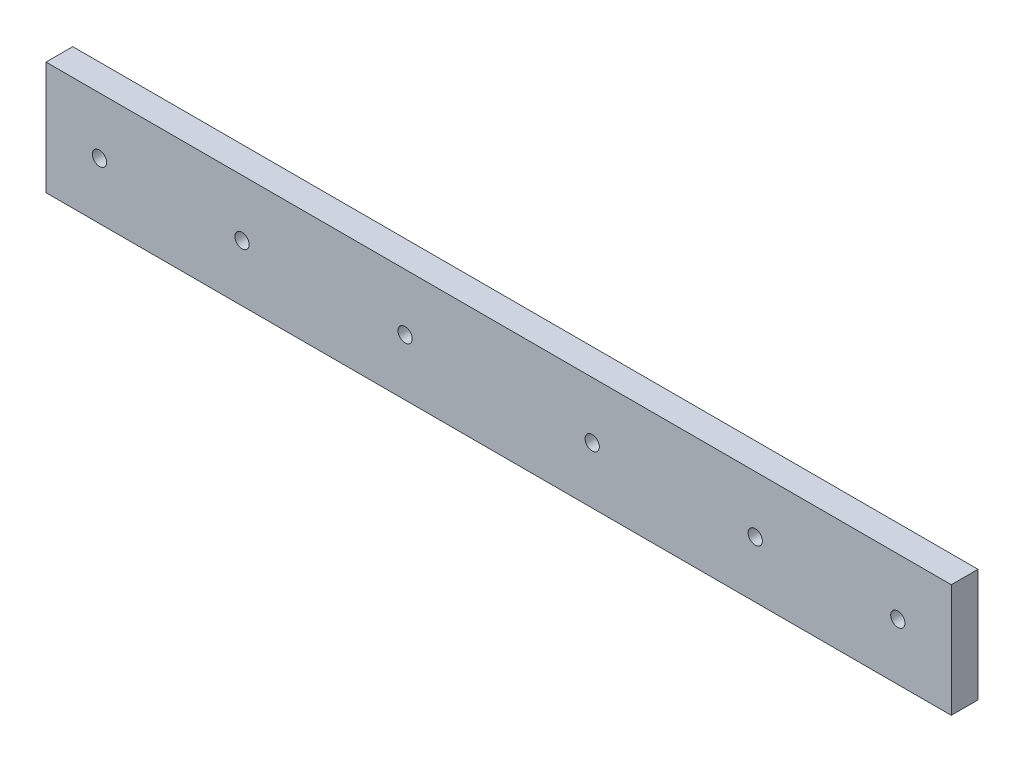
ISO-10303-21;
HEADER;
FILE_DESCRIPTION(('STEP AP214'),'2;1');
FILE_NAME('part.step','',(''),(''),'','','');
FILE_SCHEMA(('AUTOMOTIVE_DESIGN { 1 0 10303 214 1 1 1 1 }'));
ENDSEC;
DATA;
#1=APPLICATION_CONTEXT('core data for automotive mechanical design processes');
#2=APPLICATION_PROTOCOL_DEFINITION('international standard','automotive_design',2000,#1);
#3=PRODUCT_CONTEXT('',#1,'mechanical');
#4=PRODUCT('Part','Part','',(#3));
#5=PRODUCT_RELATED_PRODUCT_CATEGORY('part','',(#4));
#6=PRODUCT_DEFINITION_FORMATION('','',#4);
#7=PRODUCT_DEFINITION_CONTEXT('part definition',#1,'design');
#8=PRODUCT_DEFINITION('design','',#6,#7);
#9=PRODUCT_DEFINITION_SHAPE('','',#8);
#10=(LENGTH_UNIT() NAMED_UNIT(*) SI_UNIT(.MILLI.,.METRE.));
#11=(NAMED_UNIT(*) PLANE_ANGLE_UNIT() SI_UNIT($,.RADIAN.));
#12=(NAMED_UNIT(*) SI_UNIT($,.STERADIAN.) SOLID_ANGLE_UNIT());
#13=UNCERTAINTY_MEASURE_WITH_UNIT(LENGTH_MEASURE(1.E-05),#10,'distance_accuracy_value','');
#14=(GEOMETRIC_REPRESENTATION_CONTEXT(3) GLOBAL_UNCERTAINTY_ASSIGNED_CONTEXT((#13)) GLOBAL_UNIT_ASSIGNED_CONTEXT((#10,
#11,#12)) REPRESENTATION_CONTEXT('',''));
#15=CARTESIAN_POINT('',(0.,0.,0.));
#16=DIRECTION('',(0.,0.,1.));
#17=DIRECTION('',(1.,0.,0.));
#18=AXIS2_PLACEMENT_3D('',#15,#16,#17);
#19=CARTESIAN_POINT('',(101.6,-12.7,6.));
#20=DIRECTION('',(-1.,0.,0.));
#21=DIRECTION('',(0.,0.,1.));
#22=AXIS2_PLACEMENT_3D('',#19,#20,#21);
#23=PLANE('',#22);
#24=DIRECTION('',(0.,1.,0.));
#25=VECTOR('',#24,1.);
#26=CARTESIAN_POINT('',(101.6,-12.7,0.));
#27=LINE('',#26,#25);
#28=CARTESIAN_POINT('',(101.6,-12.7,0.));
#29=VERTEX_POINT('',#28);
#30=CARTESIAN_POINT('',(101.6,12.7,0.));
#31=VERTEX_POINT('',#30);
#32=EDGE_CURVE('E99',#29,#31,#27,.T.);
#33=ORIENTED_EDGE('',*,*,#32,.T.);
#34=DIRECTION('',(0.,0.,-1.));
#35=VECTOR('',#34,1.);
#36=CARTESIAN_POINT('',(101.6,12.7,6.));
#37=LINE('',#36,#35);
#38=CARTESIAN_POINT('',(101.6,12.7,6.));
#39=VERTEX_POINT('',#38);
#40=EDGE_CURVE('E11',#39,#31,#37,.T.);
#41=ORIENTED_EDGE('',*,*,#40,.F.);
#42=DIRECTION('',(0.,1.,0.));
#43=VECTOR('',#42,1.);
#44=CARTESIAN_POINT('',(101.6,-12.7,6.));
#45=LINE('',#44,#43);
#46=CARTESIAN_POINT('',(101.6,-12.7,6.));
#47=VERTEX_POINT('',#46);
#48=EDGE_CURVE('E87',#47,#39,#45,.T.);
#49=ORIENTED_EDGE('',*,*,#48,.F.);
#50=DIRECTION('',(0.,0.,-1.));
#51=VECTOR('',#50,1.);
#52=CARTESIAN_POINT('',(101.6,-12.7,6.));
#53=LINE('',#52,#51);
#54=EDGE_CURVE('E95',#47,#29,#53,.T.);
#55=ORIENTED_EDGE('',*,*,#54,.T.);
#56=EDGE_LOOP('',(#33,#41,#49,#55));
#57=FACE_BOUND('',#56,.T.);
#58=ADVANCED_FACE('F36',(#57),#23,.F.);
#59=CARTESIAN_POINT('',(-101.6,12.7,6.));
#60=DIRECTION('',(0.,-1.,0.));
#61=DIRECTION('',(0.,0.,-1.));
#62=AXIS2_PLACEMENT_3D('',#59,#60,#61);
#63=PLANE('',#62);
#64=DIRECTION('',(-1.,0.,0.));
#65=VECTOR('',#64,1.);
#66=CARTESIAN_POINT('',(-101.6,12.7,0.));
#67=LINE('',#66,#65);
#68=CARTESIAN_POINT('',(-101.6,12.7,0.));
#69=VERTEX_POINT('',#68);
#70=EDGE_CURVE('E91',#31,#69,#67,.T.);
#71=ORIENTED_EDGE('',*,*,#70,.T.);
#72=DIRECTION('',(0.,0.,-1.));
#73=VECTOR('',#72,1.);
#74=CARTESIAN_POINT('',(-101.6,12.7,6.));
#75=LINE('',#74,#73);
#76=CARTESIAN_POINT('',(-101.6,12.7,6.));
#77=VERTEX_POINT('',#76);
#78=EDGE_CURVE('E44',#77,#69,#75,.T.);
#79=ORIENTED_EDGE('',*,*,#78,.F.);
#80=DIRECTION('',(-1.,0.,0.));
#81=VECTOR('',#80,1.);
#82=CARTESIAN_POINT('',(-101.6,12.7,6.));
#83=LINE('',#82,#81);
#84=EDGE_CURVE('E82',#39,#77,#83,.T.);
#85=ORIENTED_EDGE('',*,*,#84,.F.);
#86=ORIENTED_EDGE('',*,*,#40,.T.);
#87=EDGE_LOOP('',(#71,#79,#85,#86));
#88=FACE_BOUND('',#87,.T.);
#89=ADVANCED_FACE('F90',(#88),#63,.F.);
#90=CARTESIAN_POINT('',(-101.6,-12.7,6.));
#91=DIRECTION('',(1.,0.,0.));
#92=DIRECTION('',(0.,0.,-1.));
#93=AXIS2_PLACEMENT_3D('',#90,#91,#92);
#94=PLANE('',#93);
#95=DIRECTION('',(0.,-1.,0.));
#96=VECTOR('',#95,1.);
#97=CARTESIAN_POINT('',(-101.6,-12.7,0.));
#98=LINE('',#97,#96);
#99=CARTESIAN_POINT('',(-101.6,-12.7,0.));
#100=VERTEX_POINT('',#99);
#101=EDGE_CURVE('E69',#69,#100,#98,.T.);
#102=ORIENTED_EDGE('',*,*,#101,.T.);
#103=DIRECTION('',(0.,0.,-1.));
#104=VECTOR('',#103,1.);
#105=CARTESIAN_POINT('',(-101.6,-12.7,6.));
#106=LINE('',#105,#104);
#107=CARTESIAN_POINT('',(-101.6,-12.7,6.));
#108=VERTEX_POINT('',#107);
#109=EDGE_CURVE('E92',#108,#100,#106,.T.);
#110=ORIENTED_EDGE('',*,*,#109,.F.);
#111=DIRECTION('',(0.,-1.,0.));
#112=VECTOR('',#111,1.);
#113=CARTESIAN_POINT('',(-101.6,-12.7,6.));
#114=LINE('',#113,#112);
#115=EDGE_CURVE('E85',#77,#108,#114,.T.);
#116=ORIENTED_EDGE('',*,*,#115,.F.);
#117=ORIENTED_EDGE('',*,*,#78,.T.);
#118=EDGE_LOOP('',(#102,#110,#116,#117));
#119=FACE_BOUND('',#118,.T.);
#120=ADVANCED_FACE('F93',(#119),#94,.F.);
#121=CARTESIAN_POINT('',(-101.6,-12.7,6.));
#122=DIRECTION('',(0.,1.,0.));
#123=DIRECTION('',(0.,0.,1.));
#124=AXIS2_PLACEMENT_3D('',#121,#122,#123);
#125=PLANE('',#124);
#126=DIRECTION('',(1.,0.,0.));
#127=VECTOR('',#126,1.);
#128=CARTESIAN_POINT('',(-101.6,-12.7,0.));
#129=LINE('',#128,#127);
#130=EDGE_CURVE('E75',#100,#29,#129,.T.);
#131=ORIENTED_EDGE('',*,*,#130,.T.);
#132=ORIENTED_EDGE('',*,*,#54,.F.);
#133=DIRECTION('',(1.,0.,0.));
#134=VECTOR('',#133,1.);
#135=CARTESIAN_POINT('',(-101.6,-12.7,6.));
#136=LINE('',#135,#134);
#137=EDGE_CURVE('E52',#108,#47,#136,.T.);
#138=ORIENTED_EDGE('',*,*,#137,.F.);
#139=ORIENTED_EDGE('',*,*,#109,.T.);
#140=EDGE_LOOP('',(#131,#132,#138,#139));
#141=FACE_BOUND('',#140,.T.);
#142=ADVANCED_FACE('F107',(#141),#125,.F.);
#143=CARTESIAN_POINT('',(0.,0.,6.));
#144=DIRECTION('',(0.,0.,-1.));
#145=DIRECTION('',(-1.,0.,0.));
#146=AXIS2_PLACEMENT_3D('',#143,#144,#145);
#147=PLANE('',#146);
#148=CARTESIAN_POINT('',(89.6,0.,6.));
#149=DIRECTION('',(0.,0.,1.));
#150=DIRECTION('',(1.,0.,0.));
#151=AXIS2_PLACEMENT_3D('',#148,#149,#150);
#152=CIRCLE('',#151,1.6);
#153=CARTESIAN_POINT('',(91.2,0.,6.));
#154=VERTEX_POINT('',#153);
#155=EDGE_CURVE('E145',#154,#154,#152,.T.);
#156=ORIENTED_EDGE('',*,*,#155,.F.);
#157=EDGE_LOOP('',(#156));
#158=FACE_BOUND('',#157,.T.);
#159=CARTESIAN_POINT('',(57.6,0.,6.));
#160=DIRECTION('',(0.,0.,1.));
#161=DIRECTION('',(1.,0.,0.));
#162=AXIS2_PLACEMENT_3D('',#159,#160,#161);
#163=CIRCLE('',#162,1.6);
#164=CARTESIAN_POINT('',(59.2,0.,6.));
#165=VERTEX_POINT('',#164);
#166=EDGE_CURVE('E139',#165,#165,#163,.T.);
#167=ORIENTED_EDGE('',*,*,#166,.F.);
#168=EDGE_LOOP('',(#167));
#169=FACE_BOUND('',#168,.T.);
#170=CARTESIAN_POINT('',(21.,0.,6.));
#171=DIRECTION('',(0.,0.,1.));
#172=DIRECTION('',(1.,0.,0.));
#173=AXIS2_PLACEMENT_3D('',#170,#171,#172);
#174=CIRCLE('',#173,1.6);
#175=CARTESIAN_POINT('',(22.6,0.,6.));
#176=VERTEX_POINT('',#175);
#177=EDGE_CURVE('E133',#176,#176,#174,.T.);
#178=ORIENTED_EDGE('',*,*,#177,.F.);
#179=EDGE_LOOP('',(#178));
#180=FACE_BOUND('',#179,.T.);
#181=CARTESIAN_POINT('',(-21.,0.,6.));
#182=DIRECTION('',(0.,0.,1.));
#183=DIRECTION('',(1.,0.,0.));
#184=AXIS2_PLACEMENT_3D('',#181,#182,#183);
#185=CIRCLE('',#184,1.6);
#186=CARTESIAN_POINT('',(-19.4,0.,6.));
#187=VERTEX_POINT('',#186);
#188=EDGE_CURVE('E127',#187,#187,#185,.T.);
#189=ORIENTED_EDGE('',*,*,#188,.F.);
#190=EDGE_LOOP('',(#189));
#191=FACE_BOUND('',#190,.T.);
#192=CARTESIAN_POINT('',(-57.6,0.,6.));
#193=DIRECTION('',(0.,0.,1.));
#194=DIRECTION('',(1.,0.,0.));
#195=AXIS2_PLACEMENT_3D('',#192,#193,#194);
#196=CIRCLE('',#195,1.6);
#197=CARTESIAN_POINT('',(-56.,0.,6.));
#198=VERTEX_POINT('',#197);
#199=EDGE_CURVE('E121',#198,#198,#196,.T.);
#200=ORIENTED_EDGE('',*,*,#199,.F.);
#201=EDGE_LOOP('',(#200));
#202=FACE_BOUND('',#201,.T.);
#203=CARTESIAN_POINT('',(-89.6,0.,6.));
#204=DIRECTION('',(0.,0.,1.));
#205=DIRECTION('',(1.,0.,0.));
#206=AXIS2_PLACEMENT_3D('',#203,#204,#205);
#207=CIRCLE('',#206,1.6);
#208=CARTESIAN_POINT('',(-88.,0.,6.));
#209=VERTEX_POINT('',#208);
#210=EDGE_CURVE('E115',#209,#209,#207,.T.);
#211=ORIENTED_EDGE('',*,*,#210,.F.);
#212=EDGE_LOOP('',(#211));
#213=FACE_BOUND('',#212,.T.);
#214=ORIENTED_EDGE('',*,*,#48,.T.);
#215=ORIENTED_EDGE('',*,*,#84,.T.);
#216=ORIENTED_EDGE('',*,*,#115,.T.);
#217=ORIENTED_EDGE('',*,*,#137,.T.);
#218=EDGE_LOOP('',(#214,#215,#216,#217));
#219=FACE_BOUND('',#218,.T.);
#220=ADVANCED_FACE('F83',(#158,#169,#180,#191,#202,#213,#219),#147,.F.);
#221=CARTESIAN_POINT('',(0.,0.,0.));
#222=DIRECTION('',(0.,0.,-1.));
#223=DIRECTION('',(-1.,0.,0.));
#224=AXIS2_PLACEMENT_3D('',#221,#222,#223);
#225=PLANE('',#224);
#226=CARTESIAN_POINT('',(89.6,0.,0.));
#227=DIRECTION('',(0.,0.,1.));
#228=DIRECTION('',(1.,0.,0.));
#229=AXIS2_PLACEMENT_3D('',#226,#227,#228);
#230=CIRCLE('',#229,1.6);
#231=CARTESIAN_POINT('',(91.2,0.,0.));
#232=VERTEX_POINT('',#231);
#233=EDGE_CURVE('E142',#232,#232,#230,.T.);
#234=ORIENTED_EDGE('',*,*,#233,.T.);
#235=EDGE_LOOP('',(#234));
#236=FACE_BOUND('',#235,.T.);
#237=CARTESIAN_POINT('',(57.6,0.,0.));
#238=DIRECTION('',(0.,0.,1.));
#239=DIRECTION('',(1.,0.,0.));
#240=AXIS2_PLACEMENT_3D('',#237,#238,#239);
#241=CIRCLE('',#240,1.6);
#242=CARTESIAN_POINT('',(59.2,0.,0.));
#243=VERTEX_POINT('',#242);
#244=EDGE_CURVE('E136',#243,#243,#241,.T.);
#245=ORIENTED_EDGE('',*,*,#244,.T.);
#246=EDGE_LOOP('',(#245));
#247=FACE_BOUND('',#246,.T.);
#248=CARTESIAN_POINT('',(21.,0.,0.));
#249=DIRECTION('',(0.,0.,1.));
#250=DIRECTION('',(1.,0.,0.));
#251=AXIS2_PLACEMENT_3D('',#248,#249,#250);
#252=CIRCLE('',#251,1.6);
#253=CARTESIAN_POINT('',(22.6,0.,0.));
#254=VERTEX_POINT('',#253);
#255=EDGE_CURVE('E130',#254,#254,#252,.T.);
#256=ORIENTED_EDGE('',*,*,#255,.T.);
#257=EDGE_LOOP('',(#256));
#258=FACE_BOUND('',#257,.T.);
#259=CARTESIAN_POINT('',(-21.,0.,0.));
#260=DIRECTION('',(0.,0.,1.));
#261=DIRECTION('',(1.,0.,0.));
#262=AXIS2_PLACEMENT_3D('',#259,#260,#261);
#263=CIRCLE('',#262,1.6);
#264=CARTESIAN_POINT('',(-19.4,0.,0.));
#265=VERTEX_POINT('',#264);
#266=EDGE_CURVE('E124',#265,#265,#263,.T.);
#267=ORIENTED_EDGE('',*,*,#266,.T.);
#268=EDGE_LOOP('',(#267));
#269=FACE_BOUND('',#268,.T.);
#270=CARTESIAN_POINT('',(-57.6,0.,0.));
#271=DIRECTION('',(0.,0.,1.));
#272=DIRECTION('',(1.,0.,0.));
#273=AXIS2_PLACEMENT_3D('',#270,#271,#272);
#274=CIRCLE('',#273,1.6);
#275=CARTESIAN_POINT('',(-56.,0.,0.));
#276=VERTEX_POINT('',#275);
#277=EDGE_CURVE('E118',#276,#276,#274,.T.);
#278=ORIENTED_EDGE('',*,*,#277,.T.);
#279=EDGE_LOOP('',(#278));
#280=FACE_BOUND('',#279,.T.);
#281=CARTESIAN_POINT('',(-89.6,0.,0.));
#282=DIRECTION('',(0.,0.,1.));
#283=DIRECTION('',(1.,0.,0.));
#284=AXIS2_PLACEMENT_3D('',#281,#282,#283);
#285=CIRCLE('',#284,1.6);
#286=CARTESIAN_POINT('',(-88.,0.,0.));
#287=VERTEX_POINT('',#286);
#288=EDGE_CURVE('E102',#287,#287,#285,.T.);
#289=ORIENTED_EDGE('',*,*,#288,.T.);
#290=EDGE_LOOP('',(#289));
#291=FACE_BOUND('',#290,.T.);
#292=ORIENTED_EDGE('',*,*,#32,.F.);
#293=ORIENTED_EDGE('',*,*,#130,.F.);
#294=ORIENTED_EDGE('',*,*,#101,.F.);
#295=ORIENTED_EDGE('',*,*,#70,.F.);
#296=EDGE_LOOP('',(#292,#293,#294,#295));
#297=FACE_BOUND('',#296,.T.);
#298=ADVANCED_FACE('F110',(#236,#247,#258,#269,#280,#291,#297),#225,.T.);
#299=CARTESIAN_POINT('',(-89.6,0.,6.));
#300=DIRECTION('',(0.,0.,1.));
#301=DIRECTION('',(1.,0.,0.));
#302=AXIS2_PLACEMENT_3D('',#299,#300,#301);
#303=CYLINDRICAL_SURFACE('',#302,1.6);
#304=ORIENTED_EDGE('',*,*,#288,.F.);
#305=EDGE_LOOP('',(#304));
#306=FACE_BOUND('',#305,.T.);
#307=ORIENTED_EDGE('',*,*,#210,.T.);
#308=EDGE_LOOP('',(#307));
#309=FACE_BOUND('',#308,.T.);
#310=ADVANCED_FACE('F164',(#306,#309),#303,.F.);
#311=CARTESIAN_POINT('',(-57.6,0.,6.));
#312=DIRECTION('',(0.,0.,1.));
#313=DIRECTION('',(1.,0.,0.));
#314=AXIS2_PLACEMENT_3D('',#311,#312,#313);
#315=CYLINDRICAL_SURFACE('',#314,1.6);
#316=ORIENTED_EDGE('',*,*,#277,.F.);
#317=EDGE_LOOP('',(#316));
#318=FACE_BOUND('',#317,.T.);
#319=ORIENTED_EDGE('',*,*,#199,.T.);
#320=EDGE_LOOP('',(#319));
#321=FACE_BOUND('',#320,.T.);
#322=ADVANCED_FACE('F166',(#318,#321),#315,.F.);
#323=CARTESIAN_POINT('',(-21.,0.,6.));
#324=DIRECTION('',(0.,0.,1.));
#325=DIRECTION('',(1.,0.,0.));
#326=AXIS2_PLACEMENT_3D('',#323,#324,#325);
#327=CYLINDRICAL_SURFACE('',#326,1.6);
#328=ORIENTED_EDGE('',*,*,#266,.F.);
#329=EDGE_LOOP('',(#328));
#330=FACE_BOUND('',#329,.T.);
#331=ORIENTED_EDGE('',*,*,#188,.T.);
#332=EDGE_LOOP('',(#331));
#333=FACE_BOUND('',#332,.T.);
#334=ADVANCED_FACE('F173',(#330,#333),#327,.F.);
#335=CARTESIAN_POINT('',(21.,0.,6.));
#336=DIRECTION('',(0.,0.,1.));
#337=DIRECTION('',(1.,0.,0.));
#338=AXIS2_PLACEMENT_3D('',#335,#336,#337);
#339=CYLINDRICAL_SURFACE('',#338,1.6);
#340=ORIENTED_EDGE('',*,*,#255,.F.);
#341=EDGE_LOOP('',(#340));
#342=FACE_BOUND('',#341,.T.);
#343=ORIENTED_EDGE('',*,*,#177,.T.);
#344=EDGE_LOOP('',(#343));
#345=FACE_BOUND('',#344,.T.);
#346=ADVANCED_FACE('F222',(#342,#345),#339,.F.);
#347=CARTESIAN_POINT('',(57.6,0.,6.));
#348=DIRECTION('',(0.,0.,1.));
#349=DIRECTION('',(1.,0.,0.));
#350=AXIS2_PLACEMENT_3D('',#347,#348,#349);
#351=CYLINDRICAL_SURFACE('',#350,1.6);
#352=ORIENTED_EDGE('',*,*,#244,.F.);
#353=EDGE_LOOP('',(#352));
#354=FACE_BOUND('',#353,.T.);
#355=ORIENTED_EDGE('',*,*,#166,.T.);
#356=EDGE_LOOP('',(#355));
#357=FACE_BOUND('',#356,.T.);
#358=ADVANCED_FACE('F232',(#354,#357),#351,.F.);
#359=CARTESIAN_POINT('',(89.6,0.,6.));
#360=DIRECTION('',(0.,0.,1.));
#361=DIRECTION('',(1.,0.,0.));
#362=AXIS2_PLACEMENT_3D('',#359,#360,#361);
#363=CYLINDRICAL_SURFACE('',#362,1.6);
#364=ORIENTED_EDGE('',*,*,#233,.F.);
#365=EDGE_LOOP('',(#364));
#366=FACE_BOUND('',#365,.T.);
#367=ORIENTED_EDGE('',*,*,#155,.T.);
#368=EDGE_LOOP('',(#367));
#369=FACE_BOUND('',#368,.T.);
#370=ADVANCED_FACE('F149',(#366,#369),#363,.F.);
#371=CLOSED_SHELL('',(#58,#89,#120,#142,#220,#298,#310,#322,#334,#346,#358,#370));
#372=MANIFOLD_SOLID_BREP('B2',#371);
#373=ADVANCED_BREP_SHAPE_REPRESENTATION('',(#18,#372),#14);
#374=SHAPE_DEFINITION_REPRESENTATION(#9,#373);
ENDSEC;
END-ISO-10303-21;
